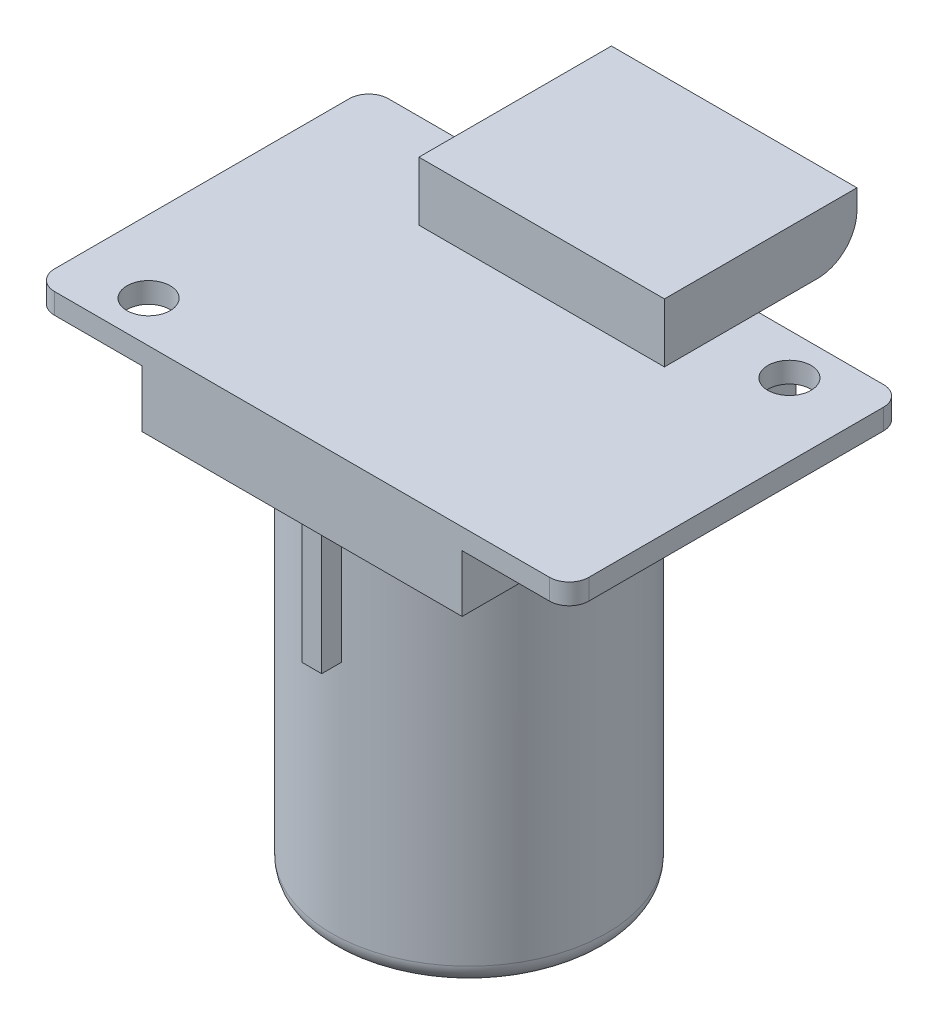
ISO-10303-21;
HEADER;
FILE_DESCRIPTION(('STEP AP214'),'2;1');
FILE_NAME('part.step','',(''),(''),'','','');
FILE_SCHEMA(('AUTOMOTIVE_DESIGN { 1 0 10303 214 1 1 1 1 }'));
ENDSEC;
DATA;
#1=APPLICATION_CONTEXT('core data for automotive mechanical design processes');
#2=APPLICATION_PROTOCOL_DEFINITION('international standard','automotive_design',2000,#1);
#3=PRODUCT_CONTEXT('',#1,'mechanical');
#4=PRODUCT('Part','Part','',(#3));
#5=PRODUCT_RELATED_PRODUCT_CATEGORY('part','',(#4));
#6=PRODUCT_DEFINITION_FORMATION('','',#4);
#7=PRODUCT_DEFINITION_CONTEXT('part definition',#1,'design');
#8=PRODUCT_DEFINITION('design','',#6,#7);
#9=PRODUCT_DEFINITION_SHAPE('','',#8);
#10=(LENGTH_UNIT() NAMED_UNIT(*) SI_UNIT(.MILLI.,.METRE.));
#11=(NAMED_UNIT(*) PLANE_ANGLE_UNIT() SI_UNIT($,.RADIAN.));
#12=(NAMED_UNIT(*) SI_UNIT($,.STERADIAN.) SOLID_ANGLE_UNIT());
#13=UNCERTAINTY_MEASURE_WITH_UNIT(LENGTH_MEASURE(1.E-05),#10,'distance_accuracy_value','');
#14=(GEOMETRIC_REPRESENTATION_CONTEXT(3) GLOBAL_UNCERTAINTY_ASSIGNED_CONTEXT((#13)) GLOBAL_UNIT_ASSIGNED_CONTEXT((#10,
#11,#12)) REPRESENTATION_CONTEXT('',''));
#15=CARTESIAN_POINT('',(0.,0.,0.));
#16=DIRECTION('',(0.,0.,1.));
#17=DIRECTION('',(1.,0.,0.));
#18=AXIS2_PLACEMENT_3D('',#15,#16,#17);
#19=CARTESIAN_POINT('',(-27.5,-1.002,424.06));
#20=DIRECTION('',(0.,1.,0.));
#21=DIRECTION('',(1.,0.,0.));
#22=AXIS2_PLACEMENT_3D('',#19,#20,#21);
#23=CYLINDRICAL_SURFACE('',#22,7.);
#24=CARTESIAN_POINT('',(-27.5,0.,424.06));
#25=DIRECTION('',(0.,-1.,0.));
#26=DIRECTION('',(-1.,0.,0.));
#27=AXIS2_PLACEMENT_3D('',#24,#25,#26);
#28=CIRCLE('',#27,7.);
#29=CARTESIAN_POINT('',(-34.5,0.,424.06));
#30=VERTEX_POINT('',#29);
#31=EDGE_CURVE('E11',#30,#30,#28,.F.);
#32=ORIENTED_EDGE('',*,*,#31,.T.);
#33=EDGE_LOOP('',(#32));
#34=FACE_BOUND('',#33,.T.);
#35=DIRECTION('',(0.,1.,0.));
#36=VECTOR('',#35,1.);
#37=CARTESIAN_POINT('',(-27.,12.2,431.042120021884));
#38=LINE('',#37,#36);
#39=CARTESIAN_POINT('',(-27.,12.2,431.042120021884));
#40=VERTEX_POINT('',#39);
#41=CARTESIAN_POINT('',(-27.,18.8,431.042120021884));
#42=VERTEX_POINT('',#41);
#43=EDGE_CURVE('E214',#40,#42,#38,.T.);
#44=ORIENTED_EDGE('',*,*,#43,.F.);
#45=CARTESIAN_POINT('',(-27.5,12.2,424.06));
#46=DIRECTION('',(0.,-1.,0.));
#47=DIRECTION('',(-1.,0.,0.));
#48=AXIS2_PLACEMENT_3D('',#45,#46,#47);
#49=CIRCLE('',#48,6.9999999999999);
#50=CARTESIAN_POINT('',(-28.,12.2,431.042120021884));
#51=VERTEX_POINT('',#50);
#52=EDGE_CURVE('E211',#40,#51,#49,.T.);
#53=ORIENTED_EDGE('',*,*,#52,.T.);
#54=DIRECTION('',(0.,1.,0.));
#55=VECTOR('',#54,1.);
#56=CARTESIAN_POINT('',(-28.,12.2,431.042120021884));
#57=LINE('',#56,#55);
#58=CARTESIAN_POINT('',(-28.,18.8,431.042120021884));
#59=VERTEX_POINT('',#58);
#60=EDGE_CURVE('E216',#51,#59,#57,.T.);
#61=ORIENTED_EDGE('',*,*,#60,.T.);
#62=CARTESIAN_POINT('',(-27.5,18.8,424.06));
#63=DIRECTION('',(0.,-1.,0.));
#64=DIRECTION('',(-1.,0.,0.));
#65=AXIS2_PLACEMENT_3D('',#62,#63,#64);
#66=CIRCLE('',#65,7.);
#67=EDGE_CURVE('E239',#59,#42,#66,.T.);
#68=ORIENTED_EDGE('',*,*,#67,.T.);
#69=EDGE_LOOP('',(#44,#53,#61,#68));
#70=FACE_BOUND('',#69,.T.);
#71=ADVANCED_FACE('F16',(#34,#70),#23,.T.);
#72=CARTESIAN_POINT('',(-27.5,21.7,424.06));
#73=DIRECTION('',(0.,-1.,0.));
#74=DIRECTION('',(-1.,0.,0.));
#75=AXIS2_PLACEMENT_3D('',#72,#73,#74);
#76=PLANE('',#75);
#77=CARTESIAN_POINT('',(-37.413626985115,21.7,430.46));
#78=DIRECTION('',(0.,1.,0.));
#79=DIRECTION('',(1.,0.,0.));
#80=AXIS2_PLACEMENT_3D('',#77,#78,#79);
#81=CIRCLE('',#80,1.1);
#82=CARTESIAN_POINT('',(-36.313626985115,21.7,430.46));
#83=VERTEX_POINT('',#82);
#84=EDGE_CURVE('E611',#83,#83,#81,.T.);
#85=ORIENTED_EDGE('',*,*,#84,.T.);
#86=EDGE_LOOP('',(#85));
#87=FACE_BOUND('',#86,.T.);
#88=DIRECTION('',(0.,0.,1.));
#89=VECTOR('',#88,1.);
#90=CARTESIAN_POINT('',(-41.1,21.7,424.06));
#91=LINE('',#90,#89);
#92=CARTESIAN_POINT('',(-41.1,21.7,416.56));
#93=VERTEX_POINT('',#92);
#94=CARTESIAN_POINT('',(-41.1,21.7,431.56));
#95=VERTEX_POINT('',#94);
#96=EDGE_CURVE('E263',#93,#95,#91,.T.);
#97=ORIENTED_EDGE('',*,*,#96,.F.);
#98=CARTESIAN_POINT('',(-40.1,21.7,416.56));
#99=DIRECTION('',(0.,-1.,0.));
#100=DIRECTION('',(-1.,0.,0.));
#101=AXIS2_PLACEMENT_3D('',#98,#99,#100);
#102=CIRCLE('',#101,1.);
#103=CARTESIAN_POINT('',(-40.1,21.7,415.56));
#104=VERTEX_POINT('',#103);
#105=EDGE_CURVE('E319',#93,#104,#102,.T.);
#106=ORIENTED_EDGE('',*,*,#105,.T.);
#107=DIRECTION('',(-1.,0.,0.));
#108=VECTOR('',#107,1.);
#109=CARTESIAN_POINT('',(-16.625,21.7,415.56));
#110=LINE('',#109,#108);
#111=CARTESIAN_POINT('',(-35.65,21.7,415.56));
#112=VERTEX_POINT('',#111);
#113=EDGE_CURVE('E272',#112,#104,#110,.T.);
#114=ORIENTED_EDGE('',*,*,#113,.F.);
#115=DIRECTION('',(0.,0.,1.));
#116=VECTOR('',#115,1.);
#117=CARTESIAN_POINT('',(-35.65,21.7,424.06));
#118=LINE('',#117,#116);
#119=CARTESIAN_POINT('',(-35.65,21.7,432.56));
#120=VERTEX_POINT('',#119);
#121=EDGE_CURVE('E232',#112,#120,#118,.T.);
#122=ORIENTED_EDGE('',*,*,#121,.T.);
#123=DIRECTION('',(-1.,0.,0.));
#124=VECTOR('',#123,1.);
#125=CARTESIAN_POINT('',(-16.625,21.7,432.56));
#126=LINE('',#125,#124);
#127=CARTESIAN_POINT('',(-40.1,21.7,432.56));
#128=VERTEX_POINT('',#127);
#129=EDGE_CURVE('E266',#120,#128,#126,.T.);
#130=ORIENTED_EDGE('',*,*,#129,.T.);
#131=CARTESIAN_POINT('',(-40.1,21.7,431.56));
#132=DIRECTION('',(0.,-1.,0.));
#133=DIRECTION('',(-1.,0.,0.));
#134=AXIS2_PLACEMENT_3D('',#131,#132,#133);
#135=CIRCLE('',#134,1.);
#136=EDGE_CURVE('E317',#128,#95,#135,.T.);
#137=ORIENTED_EDGE('',*,*,#136,.T.);
#138=EDGE_LOOP('',(#97,#106,#114,#122,#130,#137));
#139=FACE_BOUND('',#138,.T.);
#140=ADVANCED_FACE('F361',(#87,#139),#76,.T.);
#141=CARTESIAN_POINT('',(-13.9,22.75,424.06));
#142=DIRECTION('',(0.,1.,0.));
#143=DIRECTION('',(-1.,0.,0.));
#144=AXIS2_PLACEMENT_3D('',#141,#142,#143);
#145=PLANE('',#144);
#146=CARTESIAN_POINT('',(-17.5863730148851,22.75,417.66));
#147=DIRECTION('',(0.,1.,0.));
#148=DIRECTION('',(1.,0.,0.));
#149=AXIS2_PLACEMENT_3D('',#146,#147,#148);
#150=CIRCLE('',#149,1.1);
#151=CARTESIAN_POINT('',(-16.4863730148851,22.75,417.66));
#152=VERTEX_POINT('',#151);
#153=EDGE_CURVE('E312',#152,#152,#150,.F.);
#154=ORIENTED_EDGE('',*,*,#153,.T.);
#155=EDGE_LOOP('',(#154));
#156=FACE_BOUND('',#155,.T.);
#157=CARTESIAN_POINT('',(-37.413626985115,22.75,430.46));
#158=DIRECTION('',(0.,1.,0.));
#159=DIRECTION('',(1.,0.,0.));
#160=AXIS2_PLACEMENT_3D('',#157,#158,#159);
#161=CIRCLE('',#160,1.1);
#162=CARTESIAN_POINT('',(-36.313626985115,22.75,430.46));
#163=VERTEX_POINT('',#162);
#164=EDGE_CURVE('E198',#163,#163,#161,.F.);
#165=ORIENTED_EDGE('',*,*,#164,.T.);
#166=EDGE_LOOP('',(#165));
#167=FACE_BOUND('',#166,.T.);
#168=DIRECTION('',(-1.,0.,0.));
#169=VECTOR('',#168,1.);
#170=CARTESIAN_POINT('',(-16.625,22.75,415.56));
#171=LINE('',#170,#169);
#172=CARTESIAN_POINT('',(-33.75,22.75,415.56));
#173=VERTEX_POINT('',#172);
#174=CARTESIAN_POINT('',(-40.1,22.75,415.56));
#175=VERTEX_POINT('',#174);
#176=EDGE_CURVE('E283',#173,#175,#171,.T.);
#177=ORIENTED_EDGE('',*,*,#176,.T.);
#178=CARTESIAN_POINT('',(-40.1,22.75,416.56));
#179=DIRECTION('',(0.,1.,0.));
#180=DIRECTION('',(1.,0.,0.));
#181=AXIS2_PLACEMENT_3D('',#178,#179,#180);
#182=CIRCLE('',#181,1.);
#183=CARTESIAN_POINT('',(-41.1,22.75,416.56));
#184=VERTEX_POINT('',#183);
#185=EDGE_CURVE('E332',#175,#184,#182,.T.);
#186=ORIENTED_EDGE('',*,*,#185,.T.);
#187=DIRECTION('',(0.,0.,1.));
#188=VECTOR('',#187,1.);
#189=CARTESIAN_POINT('',(-41.1,22.75,424.06));
#190=LINE('',#189,#188);
#191=CARTESIAN_POINT('',(-41.1,22.75,431.56));
#192=VERTEX_POINT('',#191);
#193=EDGE_CURVE('E238',#184,#192,#190,.T.);
#194=ORIENTED_EDGE('',*,*,#193,.T.);
#195=CARTESIAN_POINT('',(-40.1,22.75,431.56));
#196=DIRECTION('',(0.,1.,0.));
#197=DIRECTION('',(1.,0.,0.));
#198=AXIS2_PLACEMENT_3D('',#195,#196,#197);
#199=CIRCLE('',#198,1.);
#200=CARTESIAN_POINT('',(-40.1,22.75,432.56));
#201=VERTEX_POINT('',#200);
#202=EDGE_CURVE('E326',#192,#201,#199,.T.);
#203=ORIENTED_EDGE('',*,*,#202,.T.);
#204=DIRECTION('',(-1.,0.,0.));
#205=VECTOR('',#204,1.);
#206=CARTESIAN_POINT('',(-16.625,22.75,432.56));
#207=LINE('',#206,#205);
#208=CARTESIAN_POINT('',(-14.9,22.75,432.56));
#209=VERTEX_POINT('',#208);
#210=EDGE_CURVE('E267',#209,#201,#207,.T.);
#211=ORIENTED_EDGE('',*,*,#210,.F.);
#212=CARTESIAN_POINT('',(-14.9,22.75,431.56));
#213=DIRECTION('',(0.,1.,0.));
#214=DIRECTION('',(1.,0.,0.));
#215=AXIS2_PLACEMENT_3D('',#212,#213,#214);
#216=CIRCLE('',#215,1.);
#217=CARTESIAN_POINT('',(-13.9,22.75,431.56));
#218=VERTEX_POINT('',#217);
#219=EDGE_CURVE('E328',#209,#218,#216,.T.);
#220=ORIENTED_EDGE('',*,*,#219,.T.);
#221=DIRECTION('',(0.,0.,1.));
#222=VECTOR('',#221,1.);
#223=CARTESIAN_POINT('',(-13.9,22.75,424.06));
#224=LINE('',#223,#222);
#225=CARTESIAN_POINT('',(-13.9,22.75,416.56));
#226=VERTEX_POINT('',#225);
#227=EDGE_CURVE('E278',#226,#218,#224,.T.);
#228=ORIENTED_EDGE('',*,*,#227,.F.);
#229=CARTESIAN_POINT('',(-14.9,22.75,416.56));
#230=DIRECTION('',(0.,1.,0.));
#231=DIRECTION('',(1.,0.,0.));
#232=AXIS2_PLACEMENT_3D('',#229,#230,#231);
#233=CIRCLE('',#232,1.);
#234=CARTESIAN_POINT('',(-14.9,22.75,415.56));
#235=VERTEX_POINT('',#234);
#236=EDGE_CURVE('E330',#226,#235,#233,.T.);
#237=ORIENTED_EDGE('',*,*,#236,.T.);
#238=CARTESIAN_POINT('',(-21.25,22.75,415.56));
#239=VERTEX_POINT('',#238);
#240=EDGE_CURVE('E281',#235,#239,#171,.T.);
#241=ORIENTED_EDGE('',*,*,#240,.T.);
#242=DIRECTION('',(0.,0.,-1.));
#243=VECTOR('',#242,1.);
#244=CARTESIAN_POINT('',(-21.25,22.75,424.06));
#245=LINE('',#244,#243);
#246=CARTESIAN_POINT('',(-21.25,22.75,420.36));
#247=VERTEX_POINT('',#246);
#248=EDGE_CURVE('E290',#247,#239,#245,.T.);
#249=ORIENTED_EDGE('',*,*,#248,.F.);
#250=DIRECTION('',(1.,0.,0.));
#251=VECTOR('',#250,1.);
#252=CARTESIAN_POINT('',(-13.9,22.75,420.36));
#253=LINE('',#252,#251);
#254=CARTESIAN_POINT('',(-33.75,22.75,420.36));
#255=VERTEX_POINT('',#254);
#256=EDGE_CURVE('E288',#255,#247,#253,.T.);
#257=ORIENTED_EDGE('',*,*,#256,.F.);
#258=DIRECTION('',(0.,0.,-1.));
#259=VECTOR('',#258,1.);
#260=CARTESIAN_POINT('',(-33.75,22.75,424.06));
#261=LINE('',#260,#259);
#262=EDGE_CURVE('E275',#255,#173,#261,.T.);
#263=ORIENTED_EDGE('',*,*,#262,.T.);
#264=EDGE_LOOP('',(#177,#186,#194,#203,#211,#220,#228,#237,#241,#249,#257,#263));
#265=FACE_BOUND('',#264,.T.);
#266=ADVANCED_FACE('F367',(#156,#167,#265),#145,.T.);
#267=CARTESIAN_POINT('',(-16.625,22.752,415.56));
#268=DIRECTION('',(0.,0.,1.));
#269=DIRECTION('',(0.,1.,0.));
#270=AXIS2_PLACEMENT_3D('',#267,#268,#269);
#271=PLANE('',#270);
#272=ORIENTED_EDGE('',*,*,#113,.T.);
#273=DIRECTION('',(0.,-1.,0.));
#274=VECTOR('',#273,1.);
#275=CARTESIAN_POINT('',(-40.1,22.752,415.56));
#276=LINE('',#275,#274);
#277=EDGE_CURVE('E324',#104,#175,#276,.F.);
#278=ORIENTED_EDGE('',*,*,#277,.T.);
#279=ORIENTED_EDGE('',*,*,#176,.F.);
#280=DIRECTION('',(1.,0.,0.));
#281=VECTOR('',#280,1.);
#282=CARTESIAN_POINT('',(-27.5,22.75,415.56));
#283=LINE('',#282,#281);
#284=EDGE_CURVE('E185',#173,#239,#283,.T.);
#285=ORIENTED_EDGE('',*,*,#284,.T.);
#286=ORIENTED_EDGE('',*,*,#240,.F.);
#287=DIRECTION('',(0.,-1.,0.));
#288=VECTOR('',#287,1.);
#289=CARTESIAN_POINT('',(-14.9,21.7,415.56));
#290=LINE('',#289,#288);
#291=CARTESIAN_POINT('',(-14.9,21.7,415.56));
#292=VERTEX_POINT('',#291);
#293=EDGE_CURVE('E321',#235,#292,#290,.T.);
#294=ORIENTED_EDGE('',*,*,#293,.T.);
#295=CARTESIAN_POINT('',(-19.35,21.7,415.56));
#296=VERTEX_POINT('',#295);
#297=EDGE_CURVE('E273',#292,#296,#110,.T.);
#298=ORIENTED_EDGE('',*,*,#297,.T.);
#299=DIRECTION('',(0.,1.,0.));
#300=VECTOR('',#299,1.);
#301=CARTESIAN_POINT('',(-19.35,18.798,415.56));
#302=LINE('',#301,#300);
#303=CARTESIAN_POINT('',(-19.35,18.8,415.56));
#304=VERTEX_POINT('',#303);
#305=EDGE_CURVE('E255',#304,#296,#302,.T.);
#306=ORIENTED_EDGE('',*,*,#305,.F.);
#307=DIRECTION('',(-1.,0.,0.));
#308=VECTOR('',#307,1.);
#309=CARTESIAN_POINT('',(-20.3,18.8,415.56));
#310=LINE('',#309,#308);
#311=CARTESIAN_POINT('',(-35.65,18.8,415.56));
#312=VERTEX_POINT('',#311);
#313=EDGE_CURVE('E243',#304,#312,#310,.T.);
#314=ORIENTED_EDGE('',*,*,#313,.T.);
#315=DIRECTION('',(0.,1.,0.));
#316=VECTOR('',#315,1.);
#317=CARTESIAN_POINT('',(-35.65,18.798,415.56));
#318=LINE('',#317,#316);
#319=EDGE_CURVE('E242',#312,#112,#318,.T.);
#320=ORIENTED_EDGE('',*,*,#319,.T.);
#321=EDGE_LOOP('',(#272,#278,#279,#285,#286,#294,#298,#306,#314,#320));
#322=FACE_BOUND('',#321,.T.);
#323=ADVANCED_FACE('F371',(#322),#271,.F.);
#324=CARTESIAN_POINT('',(-13.9,22.752,424.06));
#325=DIRECTION('',(1.,0.,0.));
#326=DIRECTION('',(0.,-1.,0.));
#327=AXIS2_PLACEMENT_3D('',#324,#325,#326);
#328=PLANE('',#327);
#329=DIRECTION('',(0.,0.,1.));
#330=VECTOR('',#329,1.);
#331=CARTESIAN_POINT('',(-13.9,21.7,424.06));
#332=LINE('',#331,#330);
#333=CARTESIAN_POINT('',(-13.9,21.7,416.56));
#334=VERTEX_POINT('',#333);
#335=CARTESIAN_POINT('',(-13.9,21.7,431.56));
#336=VERTEX_POINT('',#335);
#337=EDGE_CURVE('E270',#334,#336,#332,.T.);
#338=ORIENTED_EDGE('',*,*,#337,.F.);
#339=DIRECTION('',(0.,-1.,0.));
#340=VECTOR('',#339,1.);
#341=CARTESIAN_POINT('',(-13.9,22.75,416.56));
#342=LINE('',#341,#340);
#343=EDGE_CURVE('E339',#334,#226,#342,.F.);
#344=ORIENTED_EDGE('',*,*,#343,.T.);
#345=ORIENTED_EDGE('',*,*,#227,.T.);
#346=DIRECTION('',(0.,-1.,0.));
#347=VECTOR('',#346,1.);
#348=CARTESIAN_POINT('',(-13.9,22.752,431.56));
#349=LINE('',#348,#347);
#350=EDGE_CURVE('E337',#218,#336,#349,.T.);
#351=ORIENTED_EDGE('',*,*,#350,.T.);
#352=EDGE_LOOP('',(#338,#344,#345,#351));
#353=FACE_BOUND('',#352,.T.);
#354=ADVANCED_FACE('F384',(#353),#328,.T.);
#355=CARTESIAN_POINT('',(-16.625,22.752,432.56));
#356=DIRECTION('',(0.,0.,1.));
#357=DIRECTION('',(0.,1.,0.));
#358=AXIS2_PLACEMENT_3D('',#355,#356,#357);
#359=PLANE('',#358);
#360=CARTESIAN_POINT('',(-14.9,21.7,432.56));
#361=VERTEX_POINT('',#360);
#362=CARTESIAN_POINT('',(-19.35,21.7,432.56));
#363=VERTEX_POINT('',#362);
#364=EDGE_CURVE('E268',#361,#363,#126,.T.);
#365=ORIENTED_EDGE('',*,*,#364,.F.);
#366=DIRECTION('',(0.,-1.,0.));
#367=VECTOR('',#366,1.);
#368=CARTESIAN_POINT('',(-14.9,22.752,432.56));
#369=LINE('',#368,#367);
#370=EDGE_CURVE('E344',#361,#209,#369,.F.);
#371=ORIENTED_EDGE('',*,*,#370,.T.);
#372=ORIENTED_EDGE('',*,*,#210,.T.);
#373=DIRECTION('',(0.,-1.,0.));
#374=VECTOR('',#373,1.);
#375=CARTESIAN_POINT('',(-40.1,21.7,432.56));
#376=LINE('',#375,#374);
#377=EDGE_CURVE('E341',#201,#128,#376,.T.);
#378=ORIENTED_EDGE('',*,*,#377,.T.);
#379=ORIENTED_EDGE('',*,*,#129,.F.);
#380=DIRECTION('',(0.,1.,0.));
#381=VECTOR('',#380,1.);
#382=CARTESIAN_POINT('',(-35.65,18.798,432.56));
#383=LINE('',#382,#381);
#384=CARTESIAN_POINT('',(-35.65,18.8,432.56));
#385=VERTEX_POINT('',#384);
#386=EDGE_CURVE('E235',#385,#120,#383,.T.);
#387=ORIENTED_EDGE('',*,*,#386,.F.);
#388=DIRECTION('',(-1.,0.,0.));
#389=VECTOR('',#388,1.);
#390=CARTESIAN_POINT('',(-27.5,18.8,432.56));
#391=LINE('',#390,#389);
#392=CARTESIAN_POINT('',(-19.35,18.8,432.56));
#393=VERTEX_POINT('',#392);
#394=EDGE_CURVE('E231',#393,#385,#391,.T.);
#395=ORIENTED_EDGE('',*,*,#394,.F.);
#396=DIRECTION('',(0.,1.,0.));
#397=VECTOR('',#396,1.);
#398=CARTESIAN_POINT('',(-19.35,18.798,432.56));
#399=LINE('',#398,#397);
#400=EDGE_CURVE('E258',#393,#363,#399,.T.);
#401=ORIENTED_EDGE('',*,*,#400,.T.);
#402=EDGE_LOOP('',(#365,#371,#372,#378,#379,#387,#395,#401));
#403=FACE_BOUND('',#402,.T.);
#404=ADVANCED_FACE('F387',(#403),#359,.T.);
#405=CARTESIAN_POINT('',(-41.1,22.752,424.06));
#406=DIRECTION('',(1.,0.,0.));
#407=DIRECTION('',(0.,0.,1.));
#408=AXIS2_PLACEMENT_3D('',#405,#406,#407);
#409=PLANE('',#408);
#410=ORIENTED_EDGE('',*,*,#193,.F.);
#411=DIRECTION('',(0.,-1.,0.));
#412=VECTOR('',#411,1.);
#413=CARTESIAN_POINT('',(-41.1,22.752,416.56));
#414=LINE('',#413,#412);
#415=EDGE_CURVE('E314',#184,#93,#414,.T.);
#416=ORIENTED_EDGE('',*,*,#415,.T.);
#417=ORIENTED_EDGE('',*,*,#96,.T.);
#418=DIRECTION('',(0.,-1.,0.));
#419=VECTOR('',#418,1.);
#420=CARTESIAN_POINT('',(-41.1,22.75,431.56));
#421=LINE('',#420,#419);
#422=EDGE_CURVE('E309',#95,#192,#421,.F.);
#423=ORIENTED_EDGE('',*,*,#422,.T.);
#424=EDGE_LOOP('',(#410,#416,#417,#423));
#425=FACE_BOUND('',#424,.T.);
#426=ADVANCED_FACE('F378',(#425),#409,.F.);
#427=CARTESIAN_POINT('',(-17.5863730148851,21.7,417.66));
#428=DIRECTION('',(0.,1.,0.));
#429=DIRECTION('',(1.,0.,0.));
#430=AXIS2_PLACEMENT_3D('',#427,#428,#429);
#431=CIRCLE('',#430,1.1);
#432=CARTESIAN_POINT('',(-16.4863730148851,21.7,417.66));
#433=VERTEX_POINT('',#432);
#434=EDGE_CURVE('E612',#433,#433,#431,.T.);
#435=ORIENTED_EDGE('',*,*,#434,.T.);
#436=EDGE_LOOP('',(#435));
#437=FACE_BOUND('',#436,.T.);
#438=ORIENTED_EDGE('',*,*,#297,.F.);
#439=CARTESIAN_POINT('',(-14.9,21.7,416.56));
#440=DIRECTION('',(0.,-1.,0.));
#441=DIRECTION('',(-1.,0.,0.));
#442=AXIS2_PLACEMENT_3D('',#439,#440,#441);
#443=CIRCLE('',#442,1.);
#444=EDGE_CURVE('E335',#292,#334,#443,.T.);
#445=ORIENTED_EDGE('',*,*,#444,.T.);
#446=ORIENTED_EDGE('',*,*,#337,.T.);
#447=CARTESIAN_POINT('',(-14.9,21.7,431.56));
#448=DIRECTION('',(0.,-1.,0.));
#449=DIRECTION('',(-1.,0.,0.));
#450=AXIS2_PLACEMENT_3D('',#447,#448,#449);
#451=CIRCLE('',#450,1.);
#452=EDGE_CURVE('E31',#336,#361,#451,.T.);
#453=ORIENTED_EDGE('',*,*,#452,.T.);
#454=ORIENTED_EDGE('',*,*,#364,.T.);
#455=DIRECTION('',(0.,0.,1.));
#456=VECTOR('',#455,1.);
#457=CARTESIAN_POINT('',(-19.35,21.7,424.06));
#458=LINE('',#457,#456);
#459=EDGE_CURVE('E234',#296,#363,#458,.T.);
#460=ORIENTED_EDGE('',*,*,#459,.F.);
#461=EDGE_LOOP('',(#438,#445,#446,#453,#454,#460));
#462=FACE_BOUND('',#461,.T.);
#463=ADVANCED_FACE('F370',(#437,#462),#76,.T.);
#464=CARTESIAN_POINT('',(-19.35,18.8,424.06));
#465=DIRECTION('',(0.,-1.,0.));
#466=DIRECTION('',(-1.,0.,0.));
#467=AXIS2_PLACEMENT_3D('',#464,#465,#466);
#468=PLANE('',#467);
#469=DIRECTION('',(1.,0.,0.));
#470=VECTOR('',#469,1.);
#471=CARTESIAN_POINT('',(-19.35,18.8,432.06));
#472=LINE('',#471,#470);
#473=CARTESIAN_POINT('',(-28.,18.8,432.06));
#474=VERTEX_POINT('',#473);
#475=CARTESIAN_POINT('',(-27.,18.8,432.06));
#476=VERTEX_POINT('',#475);
#477=EDGE_CURVE('E295',#474,#476,#472,.T.);
#478=ORIENTED_EDGE('',*,*,#477,.T.);
#479=DIRECTION('',(0.,0.,-1.));
#480=VECTOR('',#479,1.);
#481=CARTESIAN_POINT('',(-27.,18.8,424.06));
#482=LINE('',#481,#480);
#483=EDGE_CURVE('E298',#476,#42,#482,.T.);
#484=ORIENTED_EDGE('',*,*,#483,.T.);
#485=ORIENTED_EDGE('',*,*,#67,.F.);
#486=DIRECTION('',(0.,0.,-1.));
#487=VECTOR('',#486,1.);
#488=CARTESIAN_POINT('',(-28.,18.8,424.06));
#489=LINE('',#488,#487);
#490=EDGE_CURVE('E293',#474,#59,#489,.T.);
#491=ORIENTED_EDGE('',*,*,#490,.F.);
#492=EDGE_LOOP('',(#478,#484,#485,#491));
#493=FACE_BOUND('',#492,.T.);
#494=DIRECTION('',(0.,0.,1.));
#495=VECTOR('',#494,1.);
#496=CARTESIAN_POINT('',(-35.65,18.8,424.06));
#497=LINE('',#496,#495);
#498=EDGE_CURVE('E245',#312,#385,#497,.T.);
#499=ORIENTED_EDGE('',*,*,#498,.F.);
#500=ORIENTED_EDGE('',*,*,#313,.F.);
#501=DIRECTION('',(0.,0.,1.));
#502=VECTOR('',#501,1.);
#503=CARTESIAN_POINT('',(-19.35,18.8,424.06));
#504=LINE('',#503,#502);
#505=EDGE_CURVE('E248',#304,#393,#504,.T.);
#506=ORIENTED_EDGE('',*,*,#505,.T.);
#507=ORIENTED_EDGE('',*,*,#394,.T.);
#508=EDGE_LOOP('',(#499,#500,#506,#507));
#509=FACE_BOUND('',#508,.T.);
#510=ADVANCED_FACE('F377',(#493,#509),#468,.T.);
#511=CARTESIAN_POINT('',(-35.65,18.798,424.06));
#512=DIRECTION('',(-1.,0.,0.));
#513=DIRECTION('',(0.,1.,0.));
#514=AXIS2_PLACEMENT_3D('',#511,#512,#513);
#515=PLANE('',#514);
#516=ORIENTED_EDGE('',*,*,#319,.F.);
#517=ORIENTED_EDGE('',*,*,#498,.T.);
#518=ORIENTED_EDGE('',*,*,#386,.T.);
#519=ORIENTED_EDGE('',*,*,#121,.F.);
#520=EDGE_LOOP('',(#516,#517,#518,#519));
#521=FACE_BOUND('',#520,.T.);
#522=ADVANCED_FACE('F383',(#521),#515,.T.);
#523=CARTESIAN_POINT('',(-19.35,18.798,424.06));
#524=DIRECTION('',(-1.,0.,0.));
#525=DIRECTION('',(0.,1.,0.));
#526=AXIS2_PLACEMENT_3D('',#523,#524,#525);
#527=PLANE('',#526);
#528=ORIENTED_EDGE('',*,*,#505,.F.);
#529=ORIENTED_EDGE('',*,*,#305,.T.);
#530=ORIENTED_EDGE('',*,*,#459,.T.);
#531=ORIENTED_EDGE('',*,*,#400,.F.);
#532=EDGE_LOOP('',(#528,#529,#530,#531));
#533=FACE_BOUND('',#532,.T.);
#534=ADVANCED_FACE('F476',(#533),#527,.F.);
#535=CARTESIAN_POINT('',(-34.5,-1.,424.06));
#536=DIRECTION('',(0.,-1.,0.));
#537=DIRECTION('',(-1.,0.,0.));
#538=AXIS2_PLACEMENT_3D('',#535,#536,#537);
#539=PLANE('',#538);
#540=CARTESIAN_POINT('',(-27.5,-1.,424.06));
#541=DIRECTION('',(0.,-1.,0.));
#542=DIRECTION('',(-1.,0.,0.));
#543=AXIS2_PLACEMENT_3D('',#540,#541,#542);
#544=CIRCLE('',#543,6.);
#545=CARTESIAN_POINT('',(-33.5,-1.,424.06));
#546=VERTEX_POINT('',#545);
#547=EDGE_CURVE('E24',#546,#546,#544,.T.);
#548=ORIENTED_EDGE('',*,*,#547,.T.);
#549=EDGE_LOOP('',(#548));
#550=FACE_BOUND('',#549,.T.);
#551=ADVANCED_FACE('F348',(#550),#539,.T.);
#552=CARTESIAN_POINT('',(-21.25,25.75,424.06));
#553=DIRECTION('',(0.,1.,0.));
#554=DIRECTION('',(-1.,0.,0.));
#555=AXIS2_PLACEMENT_3D('',#552,#553,#554);
#556=PLANE('',#555);
#557=DIRECTION('',(0.,0.,1.));
#558=VECTOR('',#557,1.);
#559=CARTESIAN_POINT('',(-21.25,25.75,417.96));
#560=LINE('',#559,#558);
#561=CARTESIAN_POINT('',(-21.25,25.75,410.56));
#562=VERTEX_POINT('',#561);
#563=CARTESIAN_POINT('',(-21.25,25.75,420.36));
#564=VERTEX_POINT('',#563);
#565=EDGE_CURVE('E175',#562,#564,#560,.T.);
#566=ORIENTED_EDGE('',*,*,#565,.F.);
#567=DIRECTION('',(-1.,0.,0.));
#568=VECTOR('',#567,1.);
#569=CARTESIAN_POINT('',(-27.5,25.75,410.56));
#570=LINE('',#569,#568);
#571=CARTESIAN_POINT('',(-33.75,25.75,410.56));
#572=VERTEX_POINT('',#571);
#573=EDGE_CURVE('E182',#562,#572,#570,.T.);
#574=ORIENTED_EDGE('',*,*,#573,.T.);
#575=DIRECTION('',(0.,0.,1.));
#576=VECTOR('',#575,1.);
#577=CARTESIAN_POINT('',(-33.75,25.75,417.96));
#578=LINE('',#577,#576);
#579=CARTESIAN_POINT('',(-33.75,25.75,420.36));
#580=VERTEX_POINT('',#579);
#581=EDGE_CURVE('E165',#572,#580,#578,.T.);
#582=ORIENTED_EDGE('',*,*,#581,.T.);
#583=DIRECTION('',(-1.,0.,0.));
#584=VECTOR('',#583,1.);
#585=CARTESIAN_POINT('',(-21.4038890966509,25.75,420.36));
#586=LINE('',#585,#584);
#587=EDGE_CURVE('E224',#564,#580,#586,.T.);
#588=ORIENTED_EDGE('',*,*,#587,.F.);
#589=EDGE_LOOP('',(#566,#574,#582,#588));
#590=FACE_BOUND('',#589,.T.);
#591=ADVANCED_FACE('F187',(#590),#556,.T.);
#592=CARTESIAN_POINT('',(-21.25,25.752,417.96));
#593=DIRECTION('',(1.,0.,0.));
#594=DIRECTION('',(0.,0.,1.));
#595=AXIS2_PLACEMENT_3D('',#592,#593,#594);
#596=PLANE('',#595);
#597=DIRECTION('',(0.,0.,1.));
#598=VECTOR('',#597,1.);
#599=CARTESIAN_POINT('',(-21.25,22.75,410.56));
#600=LINE('',#599,#598);
#601=CARTESIAN_POINT('',(-21.25,22.75,412.56));
#602=VERTEX_POINT('',#601);
#603=EDGE_CURVE('E192',#602,#239,#600,.T.);
#604=ORIENTED_EDGE('',*,*,#603,.F.);
#605=CARTESIAN_POINT('',(-21.25,24.75,412.56));
#606=DIRECTION('',(1.,0.,0.));
#607=DIRECTION('',(0.,0.,1.));
#608=AXIS2_PLACEMENT_3D('',#605,#606,#607);
#609=CIRCLE('',#608,2.);
#610=CARTESIAN_POINT('',(-21.25,24.75,410.56));
#611=VERTEX_POINT('',#610);
#612=EDGE_CURVE('E304',#602,#611,#609,.T.);
#613=ORIENTED_EDGE('',*,*,#612,.T.);
#614=DIRECTION('',(0.,-1.,0.));
#615=VECTOR('',#614,1.);
#616=CARTESIAN_POINT('',(-21.25,25.752,410.56));
#617=LINE('',#616,#615);
#618=EDGE_CURVE('E190',#562,#611,#617,.T.);
#619=ORIENTED_EDGE('',*,*,#618,.F.);
#620=ORIENTED_EDGE('',*,*,#565,.T.);
#621=DIRECTION('',(0.,-1.,0.));
#622=VECTOR('',#621,1.);
#623=CARTESIAN_POINT('',(-21.25,25.752,420.36));
#624=LINE('',#623,#622);
#625=EDGE_CURVE('E226',#564,#247,#624,.T.);
#626=ORIENTED_EDGE('',*,*,#625,.T.);
#627=ORIENTED_EDGE('',*,*,#248,.T.);
#628=EDGE_LOOP('',(#604,#613,#619,#620,#626,#627));
#629=FACE_BOUND('',#628,.T.);
#630=ADVANCED_FACE('F434',(#629),#596,.T.);
#631=CARTESIAN_POINT('',(-21.4038890966509,25.752,420.36));
#632=DIRECTION('',(0.,0.,1.));
#633=DIRECTION('',(0.,1.,0.));
#634=AXIS2_PLACEMENT_3D('',#631,#632,#633);
#635=PLANE('',#634);
#636=DIRECTION('',(0.,-1.,0.));
#637=VECTOR('',#636,1.);
#638=CARTESIAN_POINT('',(-33.75,25.752,420.36));
#639=LINE('',#638,#637);
#640=EDGE_CURVE('E171',#580,#255,#639,.T.);
#641=ORIENTED_EDGE('',*,*,#640,.T.);
#642=ORIENTED_EDGE('',*,*,#256,.T.);
#643=ORIENTED_EDGE('',*,*,#625,.F.);
#644=ORIENTED_EDGE('',*,*,#587,.T.);
#645=EDGE_LOOP('',(#641,#642,#643,#644));
#646=FACE_BOUND('',#645,.T.);
#647=ADVANCED_FACE('F438',(#646),#635,.T.);
#648=CARTESIAN_POINT('',(-33.75,25.752,417.96));
#649=DIRECTION('',(1.,0.,0.));
#650=DIRECTION('',(0.,0.,1.));
#651=AXIS2_PLACEMENT_3D('',#648,#649,#650);
#652=PLANE('',#651);
#653=DIRECTION('',(0.,-1.,0.));
#654=VECTOR('',#653,1.);
#655=CARTESIAN_POINT('',(-33.75,25.752,410.56));
#656=LINE('',#655,#654);
#657=CARTESIAN_POINT('',(-33.75,24.75,410.56));
#658=VERTEX_POINT('',#657);
#659=EDGE_CURVE('E168',#572,#658,#656,.T.);
#660=ORIENTED_EDGE('',*,*,#659,.T.);
#661=CARTESIAN_POINT('',(-33.75,24.75,412.56));
#662=DIRECTION('',(1.,0.,0.));
#663=DIRECTION('',(0.,0.,1.));
#664=AXIS2_PLACEMENT_3D('',#661,#662,#663);
#665=CIRCLE('',#664,2.);
#666=CARTESIAN_POINT('',(-33.75,22.75,412.56));
#667=VERTEX_POINT('',#666);
#668=EDGE_CURVE('E307',#658,#667,#665,.F.);
#669=ORIENTED_EDGE('',*,*,#668,.T.);
#670=DIRECTION('',(0.,0.,1.));
#671=VECTOR('',#670,1.);
#672=CARTESIAN_POINT('',(-33.75,22.75,410.56));
#673=LINE('',#672,#671);
#674=EDGE_CURVE('E201',#667,#173,#673,.T.);
#675=ORIENTED_EDGE('',*,*,#674,.T.);
#676=ORIENTED_EDGE('',*,*,#262,.F.);
#677=ORIENTED_EDGE('',*,*,#640,.F.);
#678=ORIENTED_EDGE('',*,*,#581,.F.);
#679=EDGE_LOOP('',(#660,#669,#675,#676,#677,#678));
#680=FACE_BOUND('',#679,.T.);
#681=ADVANCED_FACE('F167',(#680),#652,.F.);
#682=CARTESIAN_POINT('',(-27.,12.2,431.551060010942));
#683=DIRECTION('',(-1.,0.,0.));
#684=DIRECTION('',(0.,0.,-1.));
#685=AXIS2_PLACEMENT_3D('',#682,#683,#684);
#686=PLANE('',#685);
#687=ORIENTED_EDGE('',*,*,#483,.F.);
#688=DIRECTION('',(0.,1.,0.));
#689=VECTOR('',#688,1.);
#690=CARTESIAN_POINT('',(-27.,12.2,432.06));
#691=LINE('',#690,#689);
#692=CARTESIAN_POINT('',(-27.,12.2,432.06));
#693=VERTEX_POINT('',#692);
#694=EDGE_CURVE('E176',#693,#476,#691,.T.);
#695=ORIENTED_EDGE('',*,*,#694,.F.);
#696=DIRECTION('',(0.,0.,1.));
#697=VECTOR('',#696,1.);
#698=CARTESIAN_POINT('',(-27.,12.2,431.551060010942));
#699=LINE('',#698,#697);
#700=EDGE_CURVE('E203',#40,#693,#699,.T.);
#701=ORIENTED_EDGE('',*,*,#700,.F.);
#702=ORIENTED_EDGE('',*,*,#43,.T.);
#703=EDGE_LOOP('',(#687,#695,#701,#702));
#704=FACE_BOUND('',#703,.T.);
#705=ADVANCED_FACE('F460',(#704),#686,.F.);
#706=CARTESIAN_POINT('',(-27.5,12.2,432.06));
#707=DIRECTION('',(0.,0.,-1.));
#708=DIRECTION('',(0.,-1.,0.));
#709=AXIS2_PLACEMENT_3D('',#706,#707,#708);
#710=PLANE('',#709);
#711=ORIENTED_EDGE('',*,*,#477,.F.);
#712=DIRECTION('',(0.,1.,0.));
#713=VECTOR('',#712,1.);
#714=CARTESIAN_POINT('',(-28.,12.2,432.06));
#715=LINE('',#714,#713);
#716=CARTESIAN_POINT('',(-28.,12.2,432.06));
#717=VERTEX_POINT('',#716);
#718=EDGE_CURVE('E219',#717,#474,#715,.T.);
#719=ORIENTED_EDGE('',*,*,#718,.F.);
#720=DIRECTION('',(-1.,0.,0.));
#721=VECTOR('',#720,1.);
#722=CARTESIAN_POINT('',(-27.5,12.2,432.06));
#723=LINE('',#722,#721);
#724=EDGE_CURVE('E206',#693,#717,#723,.T.);
#725=ORIENTED_EDGE('',*,*,#724,.F.);
#726=ORIENTED_EDGE('',*,*,#694,.T.);
#727=EDGE_LOOP('',(#711,#719,#725,#726));
#728=FACE_BOUND('',#727,.T.);
#729=ADVANCED_FACE('F456',(#728),#710,.F.);
#730=CARTESIAN_POINT('',(-28.,12.2,431.551060010942));
#731=DIRECTION('',(-1.,0.,0.));
#732=DIRECTION('',(0.,0.,-1.));
#733=AXIS2_PLACEMENT_3D('',#730,#731,#732);
#734=PLANE('',#733);
#735=ORIENTED_EDGE('',*,*,#718,.T.);
#736=ORIENTED_EDGE('',*,*,#490,.T.);
#737=ORIENTED_EDGE('',*,*,#60,.F.);
#738=DIRECTION('',(0.,0.,1.));
#739=VECTOR('',#738,1.);
#740=CARTESIAN_POINT('',(-28.,12.2,431.551060010942));
#741=LINE('',#740,#739);
#742=EDGE_CURVE('E208',#51,#717,#741,.T.);
#743=ORIENTED_EDGE('',*,*,#742,.T.);
#744=EDGE_LOOP('',(#735,#736,#737,#743));
#745=FACE_BOUND('',#744,.T.);
#746=ADVANCED_FACE('F449',(#745),#734,.T.);
#747=CARTESIAN_POINT('',(-27.5,12.2,424.06));
#748=DIRECTION('',(0.,-1.,0.));
#749=DIRECTION('',(-1.,0.,0.));
#750=AXIS2_PLACEMENT_3D('',#747,#748,#749);
#751=PLANE('',#750);
#752=ORIENTED_EDGE('',*,*,#700,.T.);
#753=ORIENTED_EDGE('',*,*,#724,.T.);
#754=ORIENTED_EDGE('',*,*,#742,.F.);
#755=ORIENTED_EDGE('',*,*,#52,.F.);
#756=EDGE_LOOP('',(#752,#753,#754,#755));
#757=FACE_BOUND('',#756,.T.);
#758=ADVANCED_FACE('F442',(#757),#751,.T.);
#759=CARTESIAN_POINT('',(-27.5,22.75,410.56));
#760=DIRECTION('',(0.,-1.,0.));
#761=DIRECTION('',(-1.,0.,0.));
#762=AXIS2_PLACEMENT_3D('',#759,#760,#761);
#763=PLANE('',#762);
#764=ORIENTED_EDGE('',*,*,#674,.F.);
#765=DIRECTION('',(1.,0.,0.));
#766=VECTOR('',#765,1.);
#767=CARTESIAN_POINT('',(-27.5,22.75,412.56));
#768=LINE('',#767,#766);
#769=EDGE_CURVE('E301',#667,#602,#768,.T.);
#770=ORIENTED_EDGE('',*,*,#769,.T.);
#771=ORIENTED_EDGE('',*,*,#603,.T.);
#772=ORIENTED_EDGE('',*,*,#284,.F.);
#773=EDGE_LOOP('',(#764,#770,#771,#772));
#774=FACE_BOUND('',#773,.T.);
#775=ADVANCED_FACE('F440',(#774),#763,.T.);
#776=CARTESIAN_POINT('',(-27.5,22.275,410.56));
#777=DIRECTION('',(0.,0.,-1.));
#778=DIRECTION('',(1.,0.,0.));
#779=AXIS2_PLACEMENT_3D('',#776,#777,#778);
#780=PLANE('',#779);
#781=ORIENTED_EDGE('',*,*,#618,.T.);
#782=DIRECTION('',(1.,0.,0.));
#783=VECTOR('',#782,1.);
#784=CARTESIAN_POINT('',(-27.5,24.75,410.56));
#785=LINE('',#784,#783);
#786=EDGE_CURVE('E184',#611,#658,#785,.F.);
#787=ORIENTED_EDGE('',*,*,#786,.T.);
#788=ORIENTED_EDGE('',*,*,#659,.F.);
#789=ORIENTED_EDGE('',*,*,#573,.F.);
#790=EDGE_LOOP('',(#781,#787,#788,#789));
#791=FACE_BOUND('',#790,.T.);
#792=ADVANCED_FACE('F181',(#791),#780,.T.);
#793=CARTESIAN_POINT('',(-27.5,24.75,412.56));
#794=DIRECTION('',(1.,0.,0.));
#795=DIRECTION('',(0.,-1.,0.));
#796=AXIS2_PLACEMENT_3D('',#793,#794,#795);
#797=CYLINDRICAL_SURFACE('',#796,2.);
#798=ORIENTED_EDGE('',*,*,#668,.F.);
#799=ORIENTED_EDGE('',*,*,#786,.F.);
#800=ORIENTED_EDGE('',*,*,#612,.F.);
#801=ORIENTED_EDGE('',*,*,#769,.F.);
#802=EDGE_LOOP('',(#798,#799,#800,#801));
#803=FACE_BOUND('',#802,.T.);
#804=ADVANCED_FACE('F398',(#803),#797,.T.);
#805=CARTESIAN_POINT('',(-17.5863730148851,21.7,417.66));
#806=DIRECTION('',(0.,1.,0.));
#807=DIRECTION('',(1.,0.,0.));
#808=AXIS2_PLACEMENT_3D('',#805,#806,#807);
#809=CYLINDRICAL_SURFACE('',#808,1.1);
#810=ORIENTED_EDGE('',*,*,#153,.F.);
#811=EDGE_LOOP('',(#810));
#812=FACE_BOUND('',#811,.T.);
#813=ORIENTED_EDGE('',*,*,#434,.F.);
#814=EDGE_LOOP('',(#813));
#815=FACE_BOUND('',#814,.T.);
#816=ADVANCED_FACE('F401',(#812,#815),#809,.F.);
#817=CARTESIAN_POINT('',(-37.413626985115,21.7,430.46));
#818=DIRECTION('',(0.,1.,0.));
#819=DIRECTION('',(1.,0.,0.));
#820=AXIS2_PLACEMENT_3D('',#817,#818,#819);
#821=CYLINDRICAL_SURFACE('',#820,1.1);
#822=ORIENTED_EDGE('',*,*,#164,.F.);
#823=EDGE_LOOP('',(#822));
#824=FACE_BOUND('',#823,.T.);
#825=ORIENTED_EDGE('',*,*,#84,.F.);
#826=EDGE_LOOP('',(#825));
#827=FACE_BOUND('',#826,.T.);
#828=ADVANCED_FACE('F407',(#824,#827),#821,.F.);
#829=CARTESIAN_POINT('',(-40.1,22.752,416.56));
#830=DIRECTION('',(0.,-1.,0.));
#831=DIRECTION('',(-1.,0.,0.));
#832=AXIS2_PLACEMENT_3D('',#829,#830,#831);
#833=CYLINDRICAL_SURFACE('',#832,1.);
#834=ORIENTED_EDGE('',*,*,#185,.F.);
#835=ORIENTED_EDGE('',*,*,#277,.F.);
#836=ORIENTED_EDGE('',*,*,#105,.F.);
#837=ORIENTED_EDGE('',*,*,#415,.F.);
#838=EDGE_LOOP('',(#834,#835,#836,#837));
#839=FACE_BOUND('',#838,.T.);
#840=ADVANCED_FACE('F403',(#839),#833,.T.);
#841=CARTESIAN_POINT('',(-14.9,22.752,416.56));
#842=DIRECTION('',(0.,1.,0.));
#843=DIRECTION('',(1.,0.,0.));
#844=AXIS2_PLACEMENT_3D('',#841,#842,#843);
#845=CYLINDRICAL_SURFACE('',#844,1.);
#846=ORIENTED_EDGE('',*,*,#236,.F.);
#847=ORIENTED_EDGE('',*,*,#343,.F.);
#848=ORIENTED_EDGE('',*,*,#444,.F.);
#849=ORIENTED_EDGE('',*,*,#293,.F.);
#850=EDGE_LOOP('',(#846,#847,#848,#849));
#851=FACE_BOUND('',#850,.T.);
#852=ADVANCED_FACE('F406',(#851),#845,.T.);
#853=CARTESIAN_POINT('',(-14.9,22.752,431.56));
#854=DIRECTION('',(0.,-1.,0.));
#855=DIRECTION('',(-1.,0.,0.));
#856=AXIS2_PLACEMENT_3D('',#853,#854,#855);
#857=CYLINDRICAL_SURFACE('',#856,1.);
#858=ORIENTED_EDGE('',*,*,#219,.F.);
#859=ORIENTED_EDGE('',*,*,#370,.F.);
#860=ORIENTED_EDGE('',*,*,#452,.F.);
#861=ORIENTED_EDGE('',*,*,#350,.F.);
#862=EDGE_LOOP('',(#858,#859,#860,#861));
#863=FACE_BOUND('',#862,.T.);
#864=ADVANCED_FACE('F357',(#863),#857,.T.);
#865=CARTESIAN_POINT('',(-40.1,22.752,431.56));
#866=DIRECTION('',(0.,1.,0.));
#867=DIRECTION('',(1.,0.,0.));
#868=AXIS2_PLACEMENT_3D('',#865,#866,#867);
#869=CYLINDRICAL_SURFACE('',#868,1.);
#870=ORIENTED_EDGE('',*,*,#202,.F.);
#871=ORIENTED_EDGE('',*,*,#422,.F.);
#872=ORIENTED_EDGE('',*,*,#136,.F.);
#873=ORIENTED_EDGE('',*,*,#377,.F.);
#874=EDGE_LOOP('',(#870,#871,#872,#873));
#875=FACE_BOUND('',#874,.T.);
#876=ADVANCED_FACE('F351',(#875),#869,.T.);
#877=CARTESIAN_POINT('',(-27.5,0.,424.06));
#878=DIRECTION('',(0.,-1.,0.));
#879=DIRECTION('',(-1.,0.,0.));
#880=AXIS2_PLACEMENT_3D('',#877,#878,#879);
#881=TOROIDAL_SURFACE('',#880,6.,1.);
#882=ORIENTED_EDGE('',*,*,#31,.F.);
#883=EDGE_LOOP('',(#882));
#884=FACE_BOUND('',#883,.T.);
#885=ORIENTED_EDGE('',*,*,#547,.F.);
#886=EDGE_LOOP('',(#885));
#887=FACE_BOUND('',#886,.T.);
#888=ADVANCED_FACE('F18',(#884,#887),#881,.T.);
#889=CLOSED_SHELL('',(#71,#140,#266,#323,#354,#404,#426,#463,#510,#522,#534,#551,#591,#630,#647,
#681,#705,#729,#746,#758,#775,#792,#804,#816,#828,#840,#852,#864,#876,#888));
#890=MANIFOLD_SOLID_BREP('B1',#889);
#891=ADVANCED_BREP_SHAPE_REPRESENTATION('',(#18,#890),#14);
#892=SHAPE_DEFINITION_REPRESENTATION(#9,#891);
ENDSEC;
END-ISO-10303-21;
